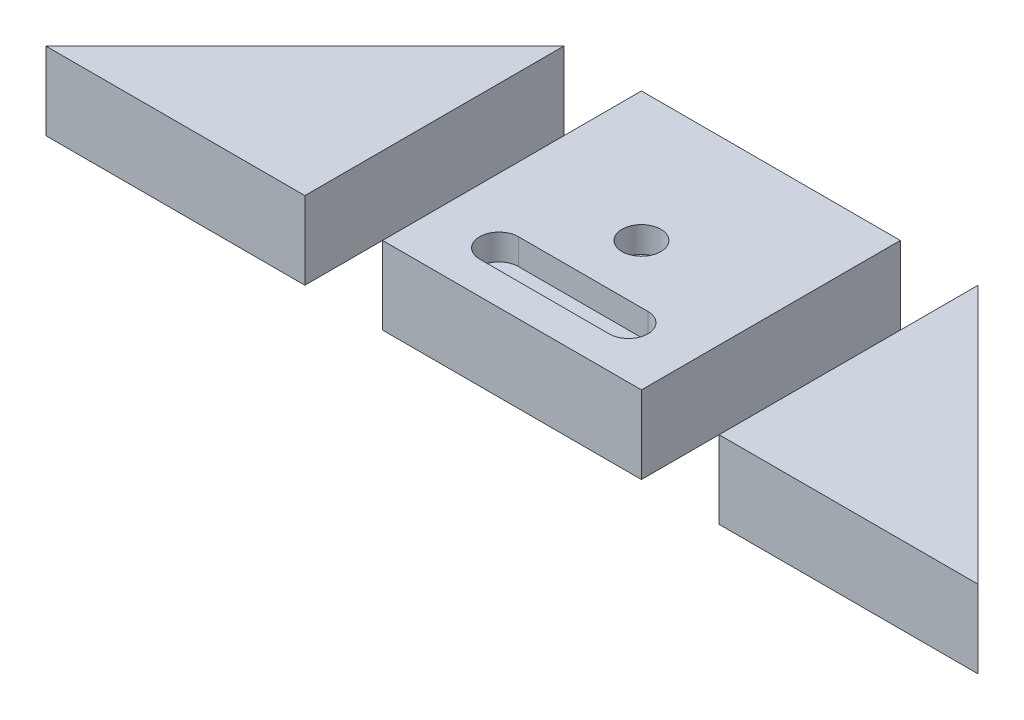
ISO-10303-21;
HEADER;
FILE_DESCRIPTION(('STEP AP214'),'2;1');
FILE_NAME('part.step','',(''),(''),'','','');
FILE_SCHEMA(('AUTOMOTIVE_DESIGN { 1 0 10303 214 1 1 1 1 }'));
ENDSEC;
DATA;
#1=APPLICATION_CONTEXT('core data for automotive mechanical design processes');
#2=APPLICATION_PROTOCOL_DEFINITION('international standard','automotive_design',2000,#1);
#3=PRODUCT_CONTEXT('',#1,'mechanical');
#4=PRODUCT('Part','Part','',(#3));
#5=PRODUCT_RELATED_PRODUCT_CATEGORY('part','',(#4));
#6=PRODUCT_DEFINITION_FORMATION('','',#4);
#7=PRODUCT_DEFINITION_CONTEXT('part definition',#1,'design');
#8=PRODUCT_DEFINITION('design','',#6,#7);
#9=PRODUCT_DEFINITION_SHAPE('','',#8);
#10=(LENGTH_UNIT() NAMED_UNIT(*) SI_UNIT(.MILLI.,.METRE.));
#11=(NAMED_UNIT(*) PLANE_ANGLE_UNIT() SI_UNIT($,.RADIAN.));
#12=(NAMED_UNIT(*) SI_UNIT($,.STERADIAN.) SOLID_ANGLE_UNIT());
#13=UNCERTAINTY_MEASURE_WITH_UNIT(LENGTH_MEASURE(1.E-05),#10,'distance_accuracy_value','');
#14=(GEOMETRIC_REPRESENTATION_CONTEXT(3) GLOBAL_UNCERTAINTY_ASSIGNED_CONTEXT((#13)) GLOBAL_UNIT_ASSIGNED_CONTEXT((#10,
#11,#12)) REPRESENTATION_CONTEXT('',''));
#15=CARTESIAN_POINT('',(0.,0.,0.));
#16=DIRECTION('',(0.,0.,1.));
#17=DIRECTION('',(1.,0.,0.));
#18=AXIS2_PLACEMENT_3D('',#15,#16,#17);
#19=CARTESIAN_POINT('',(-80.,30.,-50.));
#20=DIRECTION('',(-1.,0.,0.));
#21=DIRECTION('',(0.,0.,-1.));
#22=AXIS2_PLACEMENT_3D('',#19,#20,#21);
#23=PLANE('',#22);
#24=DIRECTION('',(0.,0.,1.));
#25=VECTOR('',#24,1.);
#26=CARTESIAN_POINT('',(-80.,0.,-50.));
#27=LINE('',#26,#25);
#28=CARTESIAN_POINT('',(-80.,0.,-50.));
#29=VERTEX_POINT('',#28);
#30=CARTESIAN_POINT('',(-80.,0.,50.));
#31=VERTEX_POINT('',#30);
#32=EDGE_CURVE('E98',#29,#31,#27,.T.);
#33=ORIENTED_EDGE('',*,*,#32,.F.);
#34=DIRECTION('',(0.,-1.,0.));
#35=VECTOR('',#34,1.);
#36=CARTESIAN_POINT('',(-80.,30.,-50.));
#37=LINE('',#36,#35);
#38=CARTESIAN_POINT('',(-80.,30.,-50.));
#39=VERTEX_POINT('',#38);
#40=EDGE_CURVE('E93',#39,#29,#37,.T.);
#41=ORIENTED_EDGE('',*,*,#40,.F.);
#42=DIRECTION('',(0.,0.,1.));
#43=VECTOR('',#42,1.);
#44=CARTESIAN_POINT('',(-80.,30.,-50.));
#45=LINE('',#44,#43);
#46=CARTESIAN_POINT('',(-80.,30.,50.));
#47=VERTEX_POINT('',#46);
#48=EDGE_CURVE('E85',#39,#47,#45,.T.);
#49=ORIENTED_EDGE('',*,*,#48,.T.);
#50=DIRECTION('',(0.,-1.,0.));
#51=VECTOR('',#50,1.);
#52=CARTESIAN_POINT('',(-80.,30.,50.));
#53=LINE('',#52,#51);
#54=EDGE_CURVE('E12',#47,#31,#53,.T.);
#55=ORIENTED_EDGE('',*,*,#54,.T.);
#56=EDGE_LOOP('',(#33,#41,#49,#55));
#57=FACE_BOUND('',#56,.T.);
#58=ADVANCED_FACE('F46',(#57),#23,.F.);
#59=CARTESIAN_POINT('',(-80.,30.,50.));
#60=DIRECTION('',(0.,0.,-1.));
#61=DIRECTION('',(1.,0.,0.));
#62=AXIS2_PLACEMENT_3D('',#59,#60,#61);
#63=PLANE('',#62);
#64=DIRECTION('',(-1.,0.,0.));
#65=VECTOR('',#64,1.);
#66=CARTESIAN_POINT('',(-80.,0.,50.));
#67=LINE('',#66,#65);
#68=CARTESIAN_POINT('',(-180.,0.,50.));
#69=VERTEX_POINT('',#68);
#70=EDGE_CURVE('E90',#31,#69,#67,.T.);
#71=ORIENTED_EDGE('',*,*,#70,.F.);
#72=ORIENTED_EDGE('',*,*,#54,.F.);
#73=DIRECTION('',(-1.,0.,0.));
#74=VECTOR('',#73,1.);
#75=CARTESIAN_POINT('',(-80.,30.,50.));
#76=LINE('',#75,#74);
#77=CARTESIAN_POINT('',(-180.,30.,50.));
#78=VERTEX_POINT('',#77);
#79=EDGE_CURVE('E81',#47,#78,#76,.T.);
#80=ORIENTED_EDGE('',*,*,#79,.T.);
#81=DIRECTION('',(0.,-1.,0.));
#82=VECTOR('',#81,1.);
#83=CARTESIAN_POINT('',(-180.,30.,50.));
#84=LINE('',#83,#82);
#85=EDGE_CURVE('E54',#78,#69,#84,.T.);
#86=ORIENTED_EDGE('',*,*,#85,.T.);
#87=EDGE_LOOP('',(#71,#72,#80,#86));
#88=FACE_BOUND('',#87,.T.);
#89=ADVANCED_FACE('F89',(#88),#63,.F.);
#90=CARTESIAN_POINT('',(-180.,30.,50.));
#91=DIRECTION('',(0.707106781186547,0.,0.707106781186548));
#92=DIRECTION('',(-0.707106781186548,0.,0.707106781186547));
#93=AXIS2_PLACEMENT_3D('',#90,#91,#92);
#94=PLANE('',#93);
#95=DIRECTION('',(0.707106781186548,0.,-0.707106781186547));
#96=VECTOR('',#95,1.);
#97=CARTESIAN_POINT('',(-180.,0.,50.));
#98=LINE('',#97,#96);
#99=EDGE_CURVE('E73',#69,#29,#98,.T.);
#100=ORIENTED_EDGE('',*,*,#99,.F.);
#101=ORIENTED_EDGE('',*,*,#85,.F.);
#102=DIRECTION('',(0.707106781186548,0.,-0.707106781186547));
#103=VECTOR('',#102,1.);
#104=CARTESIAN_POINT('',(-180.,30.,50.));
#105=LINE('',#104,#103);
#106=EDGE_CURVE('E62',#78,#39,#105,.T.);
#107=ORIENTED_EDGE('',*,*,#106,.T.);
#108=ORIENTED_EDGE('',*,*,#40,.T.);
#109=EDGE_LOOP('',(#100,#101,#107,#108));
#110=FACE_BOUND('',#109,.T.);
#111=ADVANCED_FACE('F107',(#110),#94,.F.);
#112=CARTESIAN_POINT('',(0.,30.,0.));
#113=DIRECTION('',(0.,1.,0.));
#114=DIRECTION('',(0.,0.,1.));
#115=AXIS2_PLACEMENT_3D('',#112,#113,#114);
#116=PLANE('',#115);
#117=ORIENTED_EDGE('',*,*,#48,.F.);
#118=ORIENTED_EDGE('',*,*,#106,.F.);
#119=ORIENTED_EDGE('',*,*,#79,.F.);
#120=EDGE_LOOP('',(#117,#118,#119));
#121=FACE_BOUND('',#120,.T.);
#122=ADVANCED_FACE('F83',(#121),#116,.T.);
#123=CARTESIAN_POINT('',(0.,0.,0.));
#124=DIRECTION('',(0.,1.,0.));
#125=DIRECTION('',(0.,0.,1.));
#126=AXIS2_PLACEMENT_3D('',#123,#124,#125);
#127=PLANE('',#126);
#128=ORIENTED_EDGE('',*,*,#32,.T.);
#129=ORIENTED_EDGE('',*,*,#70,.T.);
#130=ORIENTED_EDGE('',*,*,#99,.T.);
#131=EDGE_LOOP('',(#128,#129,#130));
#132=FACE_BOUND('',#131,.T.);
#133=ADVANCED_FACE('F101',(#132),#127,.F.);
#134=CLOSED_SHELL('',(#58,#89,#111,#122,#133));
#135=MANIFOLD_SOLID_BREP('B2',#134);
#136=CARTESIAN_POINT('',(80.,30.,-50.));
#137=DIRECTION('',(1.,0.,0.));
#138=DIRECTION('',(0.,0.,-1.));
#139=AXIS2_PLACEMENT_3D('',#136,#137,#138);
#140=PLANE('',#139);
#141=DIRECTION('',(0.,0.,1.));
#142=VECTOR('',#141,1.);
#143=CARTESIAN_POINT('',(80.,0.,-50.));
#144=LINE('',#143,#142);
#145=CARTESIAN_POINT('',(80.,0.,-50.));
#146=VERTEX_POINT('',#145);
#147=CARTESIAN_POINT('',(80.,0.,50.));
#148=VERTEX_POINT('',#147);
#149=EDGE_CURVE('E200',#146,#148,#144,.T.);
#150=ORIENTED_EDGE('',*,*,#149,.T.);
#151=DIRECTION('',(0.,-1.,0.));
#152=VECTOR('',#151,1.);
#153=CARTESIAN_POINT('',(80.,30.,50.));
#154=LINE('',#153,#152);
#155=CARTESIAN_POINT('',(80.,30.,50.));
#156=VERTEX_POINT('',#155);
#157=EDGE_CURVE('E44',#156,#148,#154,.T.);
#158=ORIENTED_EDGE('',*,*,#157,.F.);
#159=DIRECTION('',(0.,0.,1.));
#160=VECTOR('',#159,1.);
#161=CARTESIAN_POINT('',(80.,30.,-50.));
#162=LINE('',#161,#160);
#163=CARTESIAN_POINT('',(80.,30.,-50.));
#164=VERTEX_POINT('',#163);
#165=EDGE_CURVE('E193',#164,#156,#162,.T.);
#166=ORIENTED_EDGE('',*,*,#165,.F.);
#167=DIRECTION('',(0.,-1.,0.));
#168=VECTOR('',#167,1.);
#169=CARTESIAN_POINT('',(80.,30.,-50.));
#170=LINE('',#169,#168);
#171=EDGE_CURVE('E201',#164,#146,#170,.T.);
#172=ORIENTED_EDGE('',*,*,#171,.T.);
#173=EDGE_LOOP('',(#150,#158,#166,#172));
#174=FACE_BOUND('',#173,.T.);
#175=ADVANCED_FACE('F153',(#174),#140,.F.);
#176=CARTESIAN_POINT('',(80.,30.,50.));
#177=DIRECTION('',(0.,0.,-1.));
#178=DIRECTION('',(-1.,0.,0.));
#179=AXIS2_PLACEMENT_3D('',#176,#177,#178);
#180=PLANE('',#179);
#181=DIRECTION('',(1.,0.,0.));
#182=VECTOR('',#181,1.);
#183=CARTESIAN_POINT('',(80.,0.,50.));
#184=LINE('',#183,#182);
#185=CARTESIAN_POINT('',(180.,0.,50.));
#186=VERTEX_POINT('',#185);
#187=EDGE_CURVE('E181',#148,#186,#184,.T.);
#188=ORIENTED_EDGE('',*,*,#187,.T.);
#189=DIRECTION('',(0.,-1.,0.));
#190=VECTOR('',#189,1.);
#191=CARTESIAN_POINT('',(180.,30.,50.));
#192=LINE('',#191,#190);
#193=CARTESIAN_POINT('',(180.,30.,50.));
#194=VERTEX_POINT('',#193);
#195=EDGE_CURVE('E161',#194,#186,#192,.T.);
#196=ORIENTED_EDGE('',*,*,#195,.F.);
#197=DIRECTION('',(1.,0.,0.));
#198=VECTOR('',#197,1.);
#199=CARTESIAN_POINT('',(80.,30.,50.));
#200=LINE('',#199,#198);
#201=EDGE_CURVE('E189',#156,#194,#200,.T.);
#202=ORIENTED_EDGE('',*,*,#201,.F.);
#203=ORIENTED_EDGE('',*,*,#157,.T.);
#204=EDGE_LOOP('',(#188,#196,#202,#203));
#205=FACE_BOUND('',#204,.T.);
#206=ADVANCED_FACE('F190',(#205),#180,.F.);
#207=CARTESIAN_POINT('',(180.,30.,50.));
#208=DIRECTION('',(-0.707106781186547,0.,0.707106781186548));
#209=DIRECTION('',(0.707106781186548,0.,0.707106781186547));
#210=AXIS2_PLACEMENT_3D('',#207,#208,#209);
#211=PLANE('',#210);
#212=DIRECTION('',(-0.707106781186548,0.,-0.707106781186547));
#213=VECTOR('',#212,1.);
#214=CARTESIAN_POINT('',(180.,0.,50.));
#215=LINE('',#214,#213);
#216=EDGE_CURVE('E186',#186,#146,#215,.T.);
#217=ORIENTED_EDGE('',*,*,#216,.T.);
#218=ORIENTED_EDGE('',*,*,#171,.F.);
#219=DIRECTION('',(-0.707106781186548,0.,-0.707106781186547));
#220=VECTOR('',#219,1.);
#221=CARTESIAN_POINT('',(180.,30.,50.));
#222=LINE('',#221,#220);
#223=EDGE_CURVE('E169',#194,#164,#222,.T.);
#224=ORIENTED_EDGE('',*,*,#223,.F.);
#225=ORIENTED_EDGE('',*,*,#195,.T.);
#226=EDGE_LOOP('',(#217,#218,#224,#225));
#227=FACE_BOUND('',#226,.T.);
#228=ADVANCED_FACE('F208',(#227),#211,.F.);
#229=CARTESIAN_POINT('',(0.,30.,0.));
#230=DIRECTION('',(0.,1.,0.));
#231=DIRECTION('',(0.,0.,1.));
#232=AXIS2_PLACEMENT_3D('',#229,#230,#231);
#233=PLANE('',#232);
#234=ORIENTED_EDGE('',*,*,#165,.T.);
#235=ORIENTED_EDGE('',*,*,#201,.T.);
#236=ORIENTED_EDGE('',*,*,#223,.T.);
#237=EDGE_LOOP('',(#234,#235,#236));
#238=FACE_BOUND('',#237,.T.);
#239=ADVANCED_FACE('F196',(#238),#233,.T.);
#240=CARTESIAN_POINT('',(0.,0.,0.));
#241=DIRECTION('',(0.,1.,0.));
#242=DIRECTION('',(0.,0.,1.));
#243=AXIS2_PLACEMENT_3D('',#240,#241,#242);
#244=PLANE('',#243);
#245=ORIENTED_EDGE('',*,*,#149,.F.);
#246=ORIENTED_EDGE('',*,*,#216,.F.);
#247=ORIENTED_EDGE('',*,*,#187,.F.);
#248=EDGE_LOOP('',(#245,#246,#247));
#249=FACE_BOUND('',#248,.T.);
#250=ADVANCED_FACE('F209',(#249),#244,.F.);
#251=CLOSED_SHELL('',(#175,#206,#228,#239,#250));
#252=MANIFOLD_SOLID_BREP('B6',#251);
#253=CARTESIAN_POINT('',(50.,30.,50.));
#254=DIRECTION('',(-1.,0.,0.));
#255=DIRECTION('',(0.,0.,1.));
#256=AXIS2_PLACEMENT_3D('',#253,#254,#255);
#257=PLANE('',#256);
#258=DIRECTION('',(0.,0.,-1.));
#259=VECTOR('',#258,1.);
#260=CARTESIAN_POINT('',(50.,0.,50.));
#261=LINE('',#260,#259);
#262=CARTESIAN_POINT('',(50.,0.,50.));
#263=VERTEX_POINT('',#262);
#264=CARTESIAN_POINT('',(50.,0.,-50.));
#265=VERTEX_POINT('',#264);
#266=EDGE_CURVE('E372',#263,#265,#261,.T.);
#267=ORIENTED_EDGE('',*,*,#266,.T.);
#268=DIRECTION('',(0.,-1.,0.));
#269=VECTOR('',#268,1.);
#270=CARTESIAN_POINT('',(50.,30.,-50.));
#271=LINE('',#270,#269);
#272=CARTESIAN_POINT('',(50.,30.,-50.));
#273=VERTEX_POINT('',#272);
#274=EDGE_CURVE('E151',#273,#265,#271,.T.);
#275=ORIENTED_EDGE('',*,*,#274,.F.);
#276=DIRECTION('',(0.,0.,-1.));
#277=VECTOR('',#276,1.);
#278=CARTESIAN_POINT('',(50.,30.,50.));
#279=LINE('',#278,#277);
#280=CARTESIAN_POINT('',(50.,30.,50.));
#281=VERTEX_POINT('',#280);
#282=EDGE_CURVE('E365',#281,#273,#279,.T.);
#283=ORIENTED_EDGE('',*,*,#282,.F.);
#284=DIRECTION('',(0.,-1.,0.));
#285=VECTOR('',#284,1.);
#286=CARTESIAN_POINT('',(50.,30.,50.));
#287=LINE('',#286,#285);
#288=EDGE_CURVE('E371',#281,#263,#287,.T.);
#289=ORIENTED_EDGE('',*,*,#288,.T.);
#290=EDGE_LOOP('',(#267,#275,#283,#289));
#291=FACE_BOUND('',#290,.T.);
#292=ADVANCED_FACE('F251',(#291),#257,.F.);
#293=CARTESIAN_POINT('',(-50.,30.,-50.));
#294=DIRECTION('',(0.,0.,1.));
#295=DIRECTION('',(1.,0.,0.));
#296=AXIS2_PLACEMENT_3D('',#293,#294,#295);
#297=PLANE('',#296);
#298=DIRECTION('',(-1.,0.,0.));
#299=VECTOR('',#298,1.);
#300=CARTESIAN_POINT('',(-50.,0.,-50.));
#301=LINE('',#300,#299);
#302=CARTESIAN_POINT('',(-50.,0.,-50.));
#303=VERTEX_POINT('',#302);
#304=EDGE_CURVE('E375',#265,#303,#301,.T.);
#305=ORIENTED_EDGE('',*,*,#304,.T.);
#306=DIRECTION('',(0.,-1.,0.));
#307=VECTOR('',#306,1.);
#308=CARTESIAN_POINT('',(-50.,30.,-50.));
#309=LINE('',#308,#307);
#310=CARTESIAN_POINT('',(-50.,30.,-50.));
#311=VERTEX_POINT('',#310);
#312=EDGE_CURVE('E258',#311,#303,#309,.T.);
#313=ORIENTED_EDGE('',*,*,#312,.F.);
#314=DIRECTION('',(-1.,0.,0.));
#315=VECTOR('',#314,1.);
#316=CARTESIAN_POINT('',(-50.,30.,-50.));
#317=LINE('',#316,#315);
#318=EDGE_CURVE('E302',#273,#311,#317,.T.);
#319=ORIENTED_EDGE('',*,*,#318,.F.);
#320=ORIENTED_EDGE('',*,*,#274,.T.);
#321=EDGE_LOOP('',(#305,#313,#319,#320));
#322=FACE_BOUND('',#321,.T.);
#323=ADVANCED_FACE('F405',(#322),#297,.F.);
#324=CARTESIAN_POINT('',(-50.,30.,50.));
#325=DIRECTION('',(1.,0.,0.));
#326=DIRECTION('',(0.,0.,-1.));
#327=AXIS2_PLACEMENT_3D('',#324,#325,#326);
#328=PLANE('',#327);
#329=DIRECTION('',(0.,0.,1.));
#330=VECTOR('',#329,1.);
#331=CARTESIAN_POINT('',(-50.,0.,50.));
#332=LINE('',#331,#330);
#333=CARTESIAN_POINT('',(-50.,0.,50.));
#334=VERTEX_POINT('',#333);
#335=EDGE_CURVE('E378',#303,#334,#332,.T.);
#336=ORIENTED_EDGE('',*,*,#335,.T.);
#337=DIRECTION('',(0.,-1.,0.));
#338=VECTOR('',#337,1.);
#339=CARTESIAN_POINT('',(-50.,30.,50.));
#340=LINE('',#339,#338);
#341=CARTESIAN_POINT('',(-50.,30.,50.));
#342=VERTEX_POINT('',#341);
#343=EDGE_CURVE('E382',#342,#334,#340,.T.);
#344=ORIENTED_EDGE('',*,*,#343,.F.);
#345=DIRECTION('',(0.,0.,1.));
#346=VECTOR('',#345,1.);
#347=CARTESIAN_POINT('',(-50.,30.,50.));
#348=LINE('',#347,#346);
#349=EDGE_CURVE('E368',#311,#342,#348,.T.);
#350=ORIENTED_EDGE('',*,*,#349,.F.);
#351=ORIENTED_EDGE('',*,*,#312,.T.);
#352=EDGE_LOOP('',(#336,#344,#350,#351));
#353=FACE_BOUND('',#352,.T.);
#354=ADVANCED_FACE('F387',(#353),#328,.F.);
#355=CARTESIAN_POINT('',(-50.,30.,50.));
#356=DIRECTION('',(0.,0.,-1.));
#357=DIRECTION('',(-1.,0.,0.));
#358=AXIS2_PLACEMENT_3D('',#355,#356,#357);
#359=PLANE('',#358);
#360=DIRECTION('',(1.,0.,0.));
#361=VECTOR('',#360,1.);
#362=CARTESIAN_POINT('',(-50.,0.,50.));
#363=LINE('',#362,#361);
#364=EDGE_CURVE('E295',#334,#263,#363,.T.);
#365=ORIENTED_EDGE('',*,*,#364,.T.);
#366=ORIENTED_EDGE('',*,*,#288,.F.);
#367=DIRECTION('',(1.,0.,0.));
#368=VECTOR('',#367,1.);
#369=CARTESIAN_POINT('',(-50.,30.,50.));
#370=LINE('',#369,#368);
#371=EDGE_CURVE('E274',#342,#281,#370,.T.);
#372=ORIENTED_EDGE('',*,*,#371,.F.);
#373=ORIENTED_EDGE('',*,*,#343,.T.);
#374=EDGE_LOOP('',(#365,#366,#372,#373));
#375=FACE_BOUND('',#374,.T.);
#376=ADVANCED_FACE('F395',(#375),#359,.F.);
#377=CARTESIAN_POINT('',(0.,30.,0.));
#378=DIRECTION('',(0.,-1.,0.));
#379=DIRECTION('',(0.,0.,-1.));
#380=AXIS2_PLACEMENT_3D('',#377,#378,#379);
#381=PLANE('',#380);
#382=CARTESIAN_POINT('',(0.,30.,0.));
#383=DIRECTION('',(0.,1.,0.));
#384=DIRECTION('',(0.,0.,1.));
#385=AXIS2_PLACEMENT_3D('',#382,#383,#384);
#386=CIRCLE('',#385,7.5);
#387=CARTESIAN_POINT('',(0.,30.,7.5));
#388=VERTEX_POINT('',#387);
#389=EDGE_CURVE('E350',#388,#388,#386,.T.);
#390=ORIENTED_EDGE('',*,*,#389,.F.);
#391=EDGE_LOOP('',(#390));
#392=FACE_BOUND('',#391,.T.);
#393=DIRECTION('',(1.,0.,0.));
#394=VECTOR('',#393,1.);
#395=CARTESIAN_POINT('',(-25.,30.,37.5));
#396=LINE('',#395,#394);
#397=CARTESIAN_POINT('',(-25.,30.,37.5));
#398=VERTEX_POINT('',#397);
#399=CARTESIAN_POINT('',(25.,30.,37.5));
#400=VERTEX_POINT('',#399);
#401=EDGE_CURVE('E356',#398,#400,#396,.T.);
#402=ORIENTED_EDGE('',*,*,#401,.F.);
#403=CARTESIAN_POINT('',(-25.,30.,30.));
#404=DIRECTION('',(0.,1.,0.));
#405=DIRECTION('',(0.,0.,1.));
#406=AXIS2_PLACEMENT_3D('',#403,#404,#405);
#407=CIRCLE('',#406,7.5);
#408=CARTESIAN_POINT('',(-25.,30.,22.5));
#409=VERTEX_POINT('',#408);
#410=EDGE_CURVE('E265',#409,#398,#407,.T.);
#411=ORIENTED_EDGE('',*,*,#410,.F.);
#412=DIRECTION('',(-1.,0.,0.));
#413=VECTOR('',#412,1.);
#414=CARTESIAN_POINT('',(-25.,30.,22.5));
#415=LINE('',#414,#413);
#416=CARTESIAN_POINT('',(25.,30.,22.5));
#417=VERTEX_POINT('',#416);
#418=EDGE_CURVE('E344',#417,#409,#415,.T.);
#419=ORIENTED_EDGE('',*,*,#418,.F.);
#420=CARTESIAN_POINT('',(25.,30.,30.));
#421=DIRECTION('',(0.,1.,0.));
#422=DIRECTION('',(0.,0.,1.));
#423=AXIS2_PLACEMENT_3D('',#420,#421,#422);
#424=CIRCLE('',#423,7.5);
#425=EDGE_CURVE('E347',#400,#417,#424,.T.);
#426=ORIENTED_EDGE('',*,*,#425,.F.);
#427=EDGE_LOOP('',(#402,#411,#419,#426));
#428=FACE_BOUND('',#427,.T.);
#429=ORIENTED_EDGE('',*,*,#282,.T.);
#430=ORIENTED_EDGE('',*,*,#318,.T.);
#431=ORIENTED_EDGE('',*,*,#349,.T.);
#432=ORIENTED_EDGE('',*,*,#371,.T.);
#433=EDGE_LOOP('',(#429,#430,#431,#432));
#434=FACE_BOUND('',#433,.T.);
#435=ADVANCED_FACE('F397',(#392,#428,#434),#381,.F.);
#436=CARTESIAN_POINT('',(0.,0.,0.));
#437=DIRECTION('',(0.,-1.,0.));
#438=DIRECTION('',(0.,0.,-1.));
#439=AXIS2_PLACEMENT_3D('',#436,#437,#438);
#440=PLANE('',#439);
#441=ORIENTED_EDGE('',*,*,#266,.F.);
#442=ORIENTED_EDGE('',*,*,#364,.F.);
#443=ORIENTED_EDGE('',*,*,#335,.F.);
#444=ORIENTED_EDGE('',*,*,#304,.F.);
#445=EDGE_LOOP('',(#441,#442,#443,#444));
#446=FACE_BOUND('',#445,.T.);
#447=ADVANCED_FACE('F391',(#446),#440,.T.);
#448=CARTESIAN_POINT('',(-25.,20.,30.));
#449=DIRECTION('',(0.,1.,0.));
#450=DIRECTION('',(0.,0.,1.));
#451=AXIS2_PLACEMENT_3D('',#448,#449,#450);
#452=CYLINDRICAL_SURFACE('',#451,7.5);
#453=ORIENTED_EDGE('',*,*,#410,.T.);
#454=DIRECTION('',(0.,1.,0.));
#455=VECTOR('',#454,1.);
#456=CARTESIAN_POINT('',(-25.,20.,37.5));
#457=LINE('',#456,#455);
#458=CARTESIAN_POINT('',(-25.,20.,37.5));
#459=VERTEX_POINT('',#458);
#460=EDGE_CURVE('E322',#459,#398,#457,.T.);
#461=ORIENTED_EDGE('',*,*,#460,.F.);
#462=CARTESIAN_POINT('',(-25.,20.,30.));
#463=DIRECTION('',(0.,1.,0.));
#464=DIRECTION('',(0.,0.,1.));
#465=AXIS2_PLACEMENT_3D('',#462,#463,#464);
#466=CIRCLE('',#465,7.5);
#467=CARTESIAN_POINT('',(-25.,20.,22.5));
#468=VERTEX_POINT('',#467);
#469=EDGE_CURVE('E326',#468,#459,#466,.T.);
#470=ORIENTED_EDGE('',*,*,#469,.F.);
#471=DIRECTION('',(0.,1.,0.));
#472=VECTOR('',#471,1.);
#473=CARTESIAN_POINT('',(-25.,20.,22.5));
#474=LINE('',#473,#472);
#475=EDGE_CURVE('E360',#468,#409,#474,.T.);
#476=ORIENTED_EDGE('',*,*,#475,.T.);
#477=EDGE_LOOP('',(#453,#461,#470,#476));
#478=FACE_BOUND('',#477,.T.);
#479=ADVANCED_FACE('F324',(#478),#452,.F.);
#480=CARTESIAN_POINT('',(-25.,20.,22.5));
#481=DIRECTION('',(0.,0.,-1.));
#482=DIRECTION('',(-1.,0.,0.));
#483=AXIS2_PLACEMENT_3D('',#480,#481,#482);
#484=PLANE('',#483);
#485=ORIENTED_EDGE('',*,*,#418,.T.);
#486=ORIENTED_EDGE('',*,*,#475,.F.);
#487=DIRECTION('',(-1.,0.,0.));
#488=VECTOR('',#487,1.);
#489=CARTESIAN_POINT('',(-25.,20.,22.5));
#490=LINE('',#489,#488);
#491=CARTESIAN_POINT('',(25.,20.,22.5));
#492=VERTEX_POINT('',#491);
#493=EDGE_CURVE('E332',#492,#468,#490,.T.);
#494=ORIENTED_EDGE('',*,*,#493,.F.);
#495=DIRECTION('',(0.,1.,0.));
#496=VECTOR('',#495,1.);
#497=CARTESIAN_POINT('',(25.,20.,22.5));
#498=LINE('',#497,#496);
#499=EDGE_CURVE('E362',#492,#417,#498,.T.);
#500=ORIENTED_EDGE('',*,*,#499,.T.);
#501=EDGE_LOOP('',(#485,#486,#494,#500));
#502=FACE_BOUND('',#501,.T.);
#503=ADVANCED_FACE('F444',(#502),#484,.F.);
#504=CARTESIAN_POINT('',(25.,20.,30.));
#505=DIRECTION('',(0.,1.,0.));
#506=DIRECTION('',(0.,0.,1.));
#507=AXIS2_PLACEMENT_3D('',#504,#505,#506);
#508=CYLINDRICAL_SURFACE('',#507,7.5);
#509=ORIENTED_EDGE('',*,*,#425,.T.);
#510=ORIENTED_EDGE('',*,*,#499,.F.);
#511=CARTESIAN_POINT('',(25.,20.,30.));
#512=DIRECTION('',(0.,1.,0.));
#513=DIRECTION('',(0.,0.,1.));
#514=AXIS2_PLACEMENT_3D('',#511,#512,#513);
#515=CIRCLE('',#514,7.5);
#516=CARTESIAN_POINT('',(25.,20.,37.5));
#517=VERTEX_POINT('',#516);
#518=EDGE_CURVE('E340',#517,#492,#515,.T.);
#519=ORIENTED_EDGE('',*,*,#518,.F.);
#520=DIRECTION('',(0.,1.,0.));
#521=VECTOR('',#520,1.);
#522=CARTESIAN_POINT('',(25.,20.,37.5));
#523=LINE('',#522,#521);
#524=EDGE_CURVE('E331',#517,#400,#523,.T.);
#525=ORIENTED_EDGE('',*,*,#524,.T.);
#526=EDGE_LOOP('',(#509,#510,#519,#525));
#527=FACE_BOUND('',#526,.T.);
#528=ADVANCED_FACE('F453',(#527),#508,.F.);
#529=CARTESIAN_POINT('',(-25.,20.,37.5));
#530=DIRECTION('',(0.,0.,1.));
#531=DIRECTION('',(1.,0.,0.));
#532=AXIS2_PLACEMENT_3D('',#529,#530,#531);
#533=PLANE('',#532);
#534=ORIENTED_EDGE('',*,*,#401,.T.);
#535=ORIENTED_EDGE('',*,*,#524,.F.);
#536=DIRECTION('',(1.,0.,0.));
#537=VECTOR('',#536,1.);
#538=CARTESIAN_POINT('',(-25.,20.,37.5));
#539=LINE('',#538,#537);
#540=EDGE_CURVE('E335',#459,#517,#539,.T.);
#541=ORIENTED_EDGE('',*,*,#540,.F.);
#542=ORIENTED_EDGE('',*,*,#460,.T.);
#543=EDGE_LOOP('',(#534,#535,#541,#542));
#544=FACE_BOUND('',#543,.T.);
#545=ADVANCED_FACE('F336',(#544),#533,.F.);
#546=CARTESIAN_POINT('',(-25.,20.,30.));
#547=DIRECTION('',(0.,1.,0.));
#548=DIRECTION('',(0.,0.,1.));
#549=AXIS2_PLACEMENT_3D('',#546,#547,#548);
#550=PLANE('',#549);
#551=ORIENTED_EDGE('',*,*,#469,.T.);
#552=ORIENTED_EDGE('',*,*,#540,.T.);
#553=ORIENTED_EDGE('',*,*,#518,.T.);
#554=ORIENTED_EDGE('',*,*,#493,.T.);
#555=EDGE_LOOP('',(#551,#552,#553,#554));
#556=FACE_BOUND('',#555,.T.);
#557=ADVANCED_FACE('F342',(#556),#550,.T.);
#558=CARTESIAN_POINT('',(0.,20.,0.));
#559=DIRECTION('',(0.,1.,0.));
#560=DIRECTION('',(0.,0.,1.));
#561=AXIS2_PLACEMENT_3D('',#558,#559,#560);
#562=CYLINDRICAL_SURFACE('',#561,7.5);
#563=CARTESIAN_POINT('',(0.,20.,0.));
#564=DIRECTION('',(0.,1.,0.));
#565=DIRECTION('',(0.,0.,1.));
#566=AXIS2_PLACEMENT_3D('',#563,#564,#565);
#567=CIRCLE('',#566,7.5);
#568=CARTESIAN_POINT('',(0.,20.,7.5));
#569=VERTEX_POINT('',#568);
#570=EDGE_CURVE('E376',#569,#569,#567,.T.);
#571=ORIENTED_EDGE('',*,*,#570,.F.);
#572=EDGE_LOOP('',(#571));
#573=FACE_BOUND('',#572,.T.);
#574=ORIENTED_EDGE('',*,*,#389,.T.);
#575=EDGE_LOOP('',(#574));
#576=FACE_BOUND('',#575,.T.);
#577=ADVANCED_FACE('F480',(#573,#576),#562,.F.);
#578=CARTESIAN_POINT('',(0.,20.,0.));
#579=DIRECTION('',(0.,1.,0.));
#580=DIRECTION('',(0.,0.,1.));
#581=AXIS2_PLACEMENT_3D('',#578,#579,#580);
#582=PLANE('',#581);
#583=ORIENTED_EDGE('',*,*,#570,.T.);
#584=EDGE_LOOP('',(#583));
#585=FACE_BOUND('',#584,.T.);
#586=ADVANCED_FACE('F489',(#585),#582,.T.);
#587=CLOSED_SHELL('',(#292,#323,#354,#376,#435,#447,#479,#503,#528,#545,#557,#577,#586));
#588=MANIFOLD_SOLID_BREP('B38',#587);
#589=ADVANCED_BREP_SHAPE_REPRESENTATION('',(#18,#135,#252,#588),#14);
#590=SHAPE_DEFINITION_REPRESENTATION(#9,#589);
ENDSEC;
END-ISO-10303-21;
